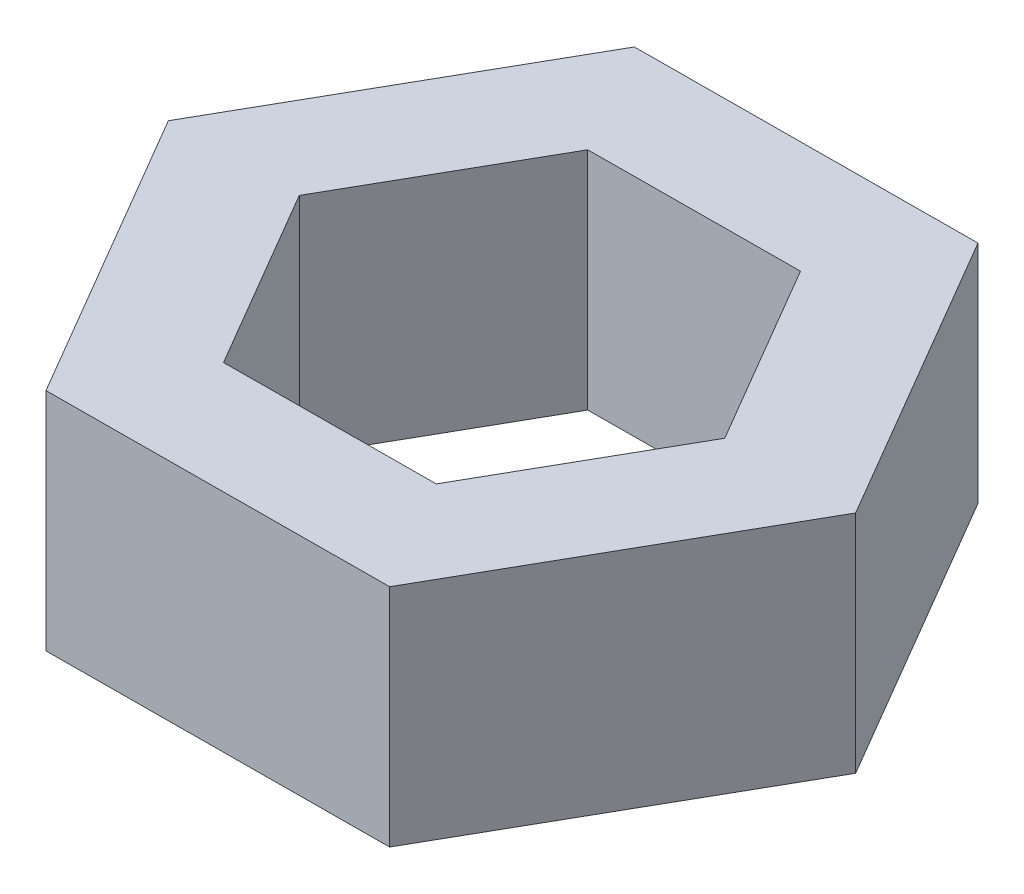
ISO-10303-21;
HEADER;
FILE_DESCRIPTION(('STEP AP214'),'2;1');
FILE_NAME('part.step','',(''),(''),'','','');
FILE_SCHEMA(('AUTOMOTIVE_DESIGN { 1 0 10303 214 1 1 1 1 }'));
ENDSEC;
DATA;
#1=APPLICATION_CONTEXT('core data for automotive mechanical design processes');
#2=APPLICATION_PROTOCOL_DEFINITION('international standard','automotive_design',2000,#1);
#3=PRODUCT_CONTEXT('',#1,'mechanical');
#4=PRODUCT('Part','Part','',(#3));
#5=PRODUCT_RELATED_PRODUCT_CATEGORY('part','',(#4));
#6=PRODUCT_DEFINITION_FORMATION('','',#4);
#7=PRODUCT_DEFINITION_CONTEXT('part definition',#1,'design');
#8=PRODUCT_DEFINITION('design','',#6,#7);
#9=PRODUCT_DEFINITION_SHAPE('','',#8);
#10=(LENGTH_UNIT() NAMED_UNIT(*) SI_UNIT(.MILLI.,.METRE.));
#11=(NAMED_UNIT(*) PLANE_ANGLE_UNIT() SI_UNIT($,.RADIAN.));
#12=(NAMED_UNIT(*) SI_UNIT($,.STERADIAN.) SOLID_ANGLE_UNIT());
#13=UNCERTAINTY_MEASURE_WITH_UNIT(LENGTH_MEASURE(1.E-05),#10,'distance_accuracy_value','');
#14=(GEOMETRIC_REPRESENTATION_CONTEXT(3) GLOBAL_UNCERTAINTY_ASSIGNED_CONTEXT((#13)) GLOBAL_UNIT_ASSIGNED_CONTEXT((#10,
#11,#12)) REPRESENTATION_CONTEXT('',''));
#15=CARTESIAN_POINT('',(0.,0.,0.));
#16=DIRECTION('',(0.,0.,1.));
#17=DIRECTION('',(1.,0.,0.));
#18=AXIS2_PLACEMENT_3D('',#15,#16,#17);
#19=CARTESIAN_POINT('',(0.,8.,0.));
#20=DIRECTION('',(0.,1.,0.));
#21=DIRECTION('',(0.,0.,1.));
#22=AXIS2_PLACEMENT_3D('',#19,#20,#21);
#23=PLANE('',#22);
#24=DIRECTION('',(0.494970800435133,0.,-0.868909607909018));
#25=VECTOR('',#24,1.);
#26=CARTESIAN_POINT('',(6.12294987188629,8.,10.46467796286));
#27=LINE('',#26,#25);
#28=CARTESIAN_POINT('',(6.12294987188629,8.,10.46467796286));
#29=VERTEX_POINT('',#28);
#30=CARTESIAN_POINT('',(12.1241518942031,8.,-0.0702911537222046));
#31=VERTEX_POINT('',#30);
#32=EDGE_CURVE('E204',#29,#31,#27,.T.);
#33=ORIENTED_EDGE('',*,*,#32,.T.);
#34=DIRECTION('',(-0.505012393824019,0.,-0.863112091262852));
#35=VECTOR('',#34,1.);
#36=CARTESIAN_POINT('',(12.1241518942031,8.,-0.0702911537222046));
#37=LINE('',#36,#35);
#38=CARTESIAN_POINT('',(6.00120202231681,8.,-10.5349691165822));
#39=VERTEX_POINT('',#38);
#40=EDGE_CURVE('E208',#31,#39,#37,.T.);
#41=ORIENTED_EDGE('',*,*,#40,.T.);
#42=DIRECTION('',(-0.999983194259152,0.,0.00579751664616607));
#43=VECTOR('',#42,1.);
#44=CARTESIAN_POINT('',(6.00120202231681,8.,-10.5349691165822));
#45=LINE('',#44,#43);
#46=CARTESIAN_POINT('',(-6.12294987188629,8.,-10.46467796286));
#47=VERTEX_POINT('',#46);
#48=EDGE_CURVE('E212',#39,#47,#45,.T.);
#49=ORIENTED_EDGE('',*,*,#48,.T.);
#50=DIRECTION('',(-0.494970800435133,0.,0.868909607909018));
#51=VECTOR('',#50,1.);
#52=CARTESIAN_POINT('',(-6.12294987188629,8.,-10.46467796286));
#53=LINE('',#52,#51);
#54=CARTESIAN_POINT('',(-12.1241518942031,8.,0.0702911537221996));
#55=VERTEX_POINT('',#54);
#56=EDGE_CURVE('E215',#47,#55,#53,.T.);
#57=ORIENTED_EDGE('',*,*,#56,.T.);
#58=DIRECTION('',(0.505012393824019,0.,0.863112091262852));
#59=VECTOR('',#58,1.);
#60=CARTESIAN_POINT('',(-12.1241518942031,8.,0.0702911537221996));
#61=LINE('',#60,#59);
#62=CARTESIAN_POINT('',(-6.00120202231681,8.,10.5349691165822));
#63=VERTEX_POINT('',#62);
#64=EDGE_CURVE('E218',#55,#63,#61,.T.);
#65=ORIENTED_EDGE('',*,*,#64,.T.);
#66=DIRECTION('',(0.999983194259152,0.,-0.00579751664616622));
#67=VECTOR('',#66,1.);
#68=CARTESIAN_POINT('',(-6.00120202231681,8.,10.5349691165822));
#69=LINE('',#68,#67);
#70=EDGE_CURVE('E221',#63,#29,#69,.T.);
#71=ORIENTED_EDGE('',*,*,#70,.T.);
#72=EDGE_LOOP('',(#33,#41,#49,#57,#65,#71));
#73=FACE_BOUND('',#72,.T.);
#74=DIRECTION('',(0.494970800435134,0.,-0.868909607909018));
#75=VECTOR('',#74,1.);
#76=CARTESIAN_POINT('',(3.79039753973913,8.,6.47813397700857));
#77=LINE('',#76,#75);
#78=CARTESIAN_POINT('',(3.79039753973913,8.,6.47813397700857));
#79=VERTEX_POINT('',#78);
#80=CARTESIAN_POINT('',(7.5054273630781,8.,-0.0435135713518393));
#81=VERTEX_POINT('',#80);
#82=EDGE_CURVE('E144',#79,#81,#77,.T.);
#83=ORIENTED_EDGE('',*,*,#82,.F.);
#84=DIRECTION('',(0.999983194259152,0.,-0.00579751664616587));
#85=VECTOR('',#84,1.);
#86=CARTESIAN_POINT('',(-3.71502982333897,8.,6.52164754836041));
#87=LINE('',#86,#85);
#88=CARTESIAN_POINT('',(-3.71502982333897,8.,6.52164754836041));
#89=VERTEX_POINT('',#88);
#90=EDGE_CURVE('E135',#89,#79,#87,.T.);
#91=ORIENTED_EDGE('',*,*,#90,.F.);
#92=DIRECTION('',(0.505012393824019,0.,0.863112091262852));
#93=VECTOR('',#92,1.);
#94=CARTESIAN_POINT('',(-7.5054273630781,8.,0.0435135713518386));
#95=LINE('',#94,#93);
#96=CARTESIAN_POINT('',(-7.5054273630781,8.,0.0435135713518389));
#97=VERTEX_POINT('',#96);
#98=EDGE_CURVE('E170',#97,#89,#95,.T.);
#99=ORIENTED_EDGE('',*,*,#98,.F.);
#100=DIRECTION('',(-0.494970800435134,0.,0.868909607909018));
#101=VECTOR('',#100,1.);
#102=CARTESIAN_POINT('',(-3.79039753973913,8.,-6.47813397700857));
#103=LINE('',#102,#101);
#104=CARTESIAN_POINT('',(-3.79039753973913,8.,-6.47813397700857));
#105=VERTEX_POINT('',#104);
#106=EDGE_CURVE('E167',#105,#97,#103,.T.);
#107=ORIENTED_EDGE('',*,*,#106,.F.);
#108=DIRECTION('',(-0.999983194259152,0.,0.0057975166461661));
#109=VECTOR('',#108,1.);
#110=CARTESIAN_POINT('',(3.71502982333897,8.,-6.52164754836041));
#111=LINE('',#110,#109);
#112=CARTESIAN_POINT('',(3.71502982333897,8.,-6.52164754836041));
#113=VERTEX_POINT('',#112);
#114=EDGE_CURVE('E162',#113,#105,#111,.T.);
#115=ORIENTED_EDGE('',*,*,#114,.F.);
#116=DIRECTION('',(-0.505012393824019,0.,-0.863112091262852));
#117=VECTOR('',#116,1.);
#118=CARTESIAN_POINT('',(7.5054273630781,8.,-0.0435135713518393));
#119=LINE('',#118,#117);
#120=EDGE_CURVE('E158',#81,#113,#119,.T.);
#121=ORIENTED_EDGE('',*,*,#120,.F.);
#122=EDGE_LOOP('',(#83,#91,#99,#107,#115,#121));
#123=FACE_BOUND('',#122,.T.);
#124=ADVANCED_FACE('F45',(#73,#123),#23,.T.);
#125=CARTESIAN_POINT('',(0.,0.,0.));
#126=DIRECTION('',(0.,1.,0.));
#127=DIRECTION('',(0.,0.,1.));
#128=AXIS2_PLACEMENT_3D('',#125,#126,#127);
#129=PLANE('',#128);
#130=DIRECTION('',(0.494970800435133,0.,-0.868909607909018));
#131=VECTOR('',#130,1.);
#132=CARTESIAN_POINT('',(6.12294987188629,0.,10.46467796286));
#133=LINE('',#132,#131);
#134=CARTESIAN_POINT('',(6.12294987188629,0.,10.46467796286));
#135=VERTEX_POINT('',#134);
#136=CARTESIAN_POINT('',(12.1241518942031,0.,-0.0702911537222046));
#137=VERTEX_POINT('',#136);
#138=EDGE_CURVE('E153',#135,#137,#133,.T.);
#139=ORIENTED_EDGE('',*,*,#138,.F.);
#140=DIRECTION('',(0.999983194259152,0.,-0.00579751664616622));
#141=VECTOR('',#140,1.);
#142=CARTESIAN_POINT('',(-6.00120202231681,0.,10.5349691165822));
#143=LINE('',#142,#141);
#144=CARTESIAN_POINT('',(-6.00120202231681,0.,10.5349691165822));
#145=VERTEX_POINT('',#144);
#146=EDGE_CURVE('E209',#145,#135,#143,.T.);
#147=ORIENTED_EDGE('',*,*,#146,.F.);
#148=DIRECTION('',(0.505012393824019,0.,0.863112091262852));
#149=VECTOR('',#148,1.);
#150=CARTESIAN_POINT('',(-12.1241518942031,0.,0.0702911537221996));
#151=LINE('',#150,#149);
#152=CARTESIAN_POINT('',(-12.1241518942031,0.,0.0702911537221996));
#153=VERTEX_POINT('',#152);
#154=EDGE_CURVE('E237',#153,#145,#151,.T.);
#155=ORIENTED_EDGE('',*,*,#154,.F.);
#156=DIRECTION('',(-0.494970800435133,0.,0.868909607909018));
#157=VECTOR('',#156,1.);
#158=CARTESIAN_POINT('',(-6.12294987188629,0.,-10.46467796286));
#159=LINE('',#158,#157);
#160=CARTESIAN_POINT('',(-6.12294987188629,0.,-10.46467796286));
#161=VERTEX_POINT('',#160);
#162=EDGE_CURVE('E234',#161,#153,#159,.T.);
#163=ORIENTED_EDGE('',*,*,#162,.F.);
#164=DIRECTION('',(-0.999983194259152,0.,0.00579751664616607));
#165=VECTOR('',#164,1.);
#166=CARTESIAN_POINT('',(6.00120202231681,0.,-10.5349691165822));
#167=LINE('',#166,#165);
#168=CARTESIAN_POINT('',(6.00120202231681,0.,-10.5349691165822));
#169=VERTEX_POINT('',#168);
#170=EDGE_CURVE('E231',#169,#161,#167,.T.);
#171=ORIENTED_EDGE('',*,*,#170,.F.);
#172=DIRECTION('',(-0.505012393824019,0.,-0.863112091262852));
#173=VECTOR('',#172,1.);
#174=CARTESIAN_POINT('',(12.1241518942031,0.,-0.0702911537222046));
#175=LINE('',#174,#173);
#176=EDGE_CURVE('E228',#137,#169,#175,.T.);
#177=ORIENTED_EDGE('',*,*,#176,.F.);
#178=EDGE_LOOP('',(#139,#147,#155,#163,#171,#177));
#179=FACE_BOUND('',#178,.T.);
#180=DIRECTION('',(0.999983194259152,0.,-0.00579751664616587));
#181=VECTOR('',#180,1.);
#182=CARTESIAN_POINT('',(-3.71502982333897,0.,6.52164754836041));
#183=LINE('',#182,#181);
#184=CARTESIAN_POINT('',(-3.71502982333897,0.,6.52164754836041));
#185=VERTEX_POINT('',#184);
#186=CARTESIAN_POINT('',(3.79039753973913,0.,6.47813397700857));
#187=VERTEX_POINT('',#186);
#188=EDGE_CURVE('E69',#185,#187,#183,.T.);
#189=ORIENTED_EDGE('',*,*,#188,.T.);
#190=DIRECTION('',(0.494970800435134,0.,-0.868909607909018));
#191=VECTOR('',#190,1.);
#192=CARTESIAN_POINT('',(3.79039753973913,0.,6.47813397700857));
#193=LINE('',#192,#191);
#194=CARTESIAN_POINT('',(7.5054273630781,0.,-0.0435135713518393));
#195=VERTEX_POINT('',#194);
#196=EDGE_CURVE('E151',#187,#195,#193,.T.);
#197=ORIENTED_EDGE('',*,*,#196,.T.);
#198=DIRECTION('',(-0.505012393824019,0.,-0.863112091262852));
#199=VECTOR('',#198,1.);
#200=CARTESIAN_POINT('',(7.5054273630781,0.,-0.0435135713518393));
#201=LINE('',#200,#199);
#202=CARTESIAN_POINT('',(3.71502982333897,0.,-6.52164754836041));
#203=VERTEX_POINT('',#202);
#204=EDGE_CURVE('E177',#195,#203,#201,.T.);
#205=ORIENTED_EDGE('',*,*,#204,.T.);
#206=DIRECTION('',(-0.999983194259152,0.,0.0057975166461661));
#207=VECTOR('',#206,1.);
#208=CARTESIAN_POINT('',(3.71502982333897,0.,-6.52164754836041));
#209=LINE('',#208,#207);
#210=CARTESIAN_POINT('',(-3.79039753973913,0.,-6.47813397700857));
#211=VERTEX_POINT('',#210);
#212=EDGE_CURVE('E181',#203,#211,#209,.T.);
#213=ORIENTED_EDGE('',*,*,#212,.T.);
#214=DIRECTION('',(-0.494970800435134,0.,0.868909607909018));
#215=VECTOR('',#214,1.);
#216=CARTESIAN_POINT('',(-3.79039753973913,0.,-6.47813397700857));
#217=LINE('',#216,#215);
#218=CARTESIAN_POINT('',(-7.5054273630781,0.,0.0435135713518386));
#219=VERTEX_POINT('',#218);
#220=EDGE_CURVE('E185',#211,#219,#217,.T.);
#221=ORIENTED_EDGE('',*,*,#220,.T.);
#222=DIRECTION('',(0.505012393824019,0.,0.863112091262852));
#223=VECTOR('',#222,1.);
#224=CARTESIAN_POINT('',(-7.5054273630781,0.,0.0435135713518386));
#225=LINE('',#224,#223);
#226=EDGE_CURVE('E145',#219,#185,#225,.T.);
#227=ORIENTED_EDGE('',*,*,#226,.T.);
#228=EDGE_LOOP('',(#189,#197,#205,#213,#221,#227));
#229=FACE_BOUND('',#228,.T.);
#230=ADVANCED_FACE('F268',(#179,#229),#129,.F.);
#231=CARTESIAN_POINT('',(6.12294987188629,8.,10.46467796286));
#232=DIRECTION('',(-0.868909607909018,0.,-0.494970800435133));
#233=DIRECTION('',(-0.494970800435133,0.,0.868909607909018));
#234=AXIS2_PLACEMENT_3D('',#231,#232,#233);
#235=PLANE('',#234);
#236=ORIENTED_EDGE('',*,*,#138,.T.);
#237=DIRECTION('',(0.,-1.,0.));
#238=VECTOR('',#237,1.);
#239=CARTESIAN_POINT('',(12.1241518942031,8.,-0.0702911537222046));
#240=LINE('',#239,#238);
#241=EDGE_CURVE('E11',#31,#137,#240,.T.);
#242=ORIENTED_EDGE('',*,*,#241,.F.);
#243=ORIENTED_EDGE('',*,*,#32,.F.);
#244=DIRECTION('',(0.,-1.,0.));
#245=VECTOR('',#244,1.);
#246=CARTESIAN_POINT('',(6.12294987188629,8.,10.46467796286));
#247=LINE('',#246,#245);
#248=EDGE_CURVE('E224',#29,#135,#247,.T.);
#249=ORIENTED_EDGE('',*,*,#248,.T.);
#250=EDGE_LOOP('',(#236,#242,#243,#249));
#251=FACE_BOUND('',#250,.T.);
#252=ADVANCED_FACE('F47',(#251),#235,.F.);
#253=CARTESIAN_POINT('',(12.1241518942031,8.,-0.0702911537222046));
#254=DIRECTION('',(-0.863112091262852,0.,0.505012393824019));
#255=DIRECTION('',(0.505012393824019,0.,0.863112091262852));
#256=AXIS2_PLACEMENT_3D('',#253,#254,#255);
#257=PLANE('',#256);
#258=ORIENTED_EDGE('',*,*,#176,.T.);
#259=DIRECTION('',(0.,-1.,0.));
#260=VECTOR('',#259,1.);
#261=CARTESIAN_POINT('',(6.00120202231681,8.,-10.5349691165822));
#262=LINE('',#261,#260);
#263=EDGE_CURVE('E54',#39,#169,#262,.T.);
#264=ORIENTED_EDGE('',*,*,#263,.F.);
#265=ORIENTED_EDGE('',*,*,#40,.F.);
#266=ORIENTED_EDGE('',*,*,#241,.T.);
#267=EDGE_LOOP('',(#258,#264,#265,#266));
#268=FACE_BOUND('',#267,.T.);
#269=ADVANCED_FACE('F285',(#268),#257,.F.);
#270=CARTESIAN_POINT('',(6.00120202231681,8.,-10.5349691165822));
#271=DIRECTION('',(0.00579751664616607,0.,0.999983194259152));
#272=DIRECTION('',(0.999983194259152,0.,-0.00579751664616607));
#273=AXIS2_PLACEMENT_3D('',#270,#271,#272);
#274=PLANE('',#273);
#275=ORIENTED_EDGE('',*,*,#170,.T.);
#276=DIRECTION('',(0.,-1.,0.));
#277=VECTOR('',#276,1.);
#278=CARTESIAN_POINT('',(-6.12294987188629,8.,-10.46467796286));
#279=LINE('',#278,#277);
#280=EDGE_CURVE('E253',#47,#161,#279,.T.);
#281=ORIENTED_EDGE('',*,*,#280,.F.);
#282=ORIENTED_EDGE('',*,*,#48,.F.);
#283=ORIENTED_EDGE('',*,*,#263,.T.);
#284=EDGE_LOOP('',(#275,#281,#282,#283));
#285=FACE_BOUND('',#284,.T.);
#286=ADVANCED_FACE('F262',(#285),#274,.F.);
#287=CARTESIAN_POINT('',(-6.12294987188629,8.,-10.46467796286));
#288=DIRECTION('',(0.868909607909018,0.,0.494970800435133));
#289=DIRECTION('',(0.494970800435133,0.,-0.868909607909018));
#290=AXIS2_PLACEMENT_3D('',#287,#288,#289);
#291=PLANE('',#290);
#292=ORIENTED_EDGE('',*,*,#162,.T.);
#293=DIRECTION('',(0.,-1.,0.));
#294=VECTOR('',#293,1.);
#295=CARTESIAN_POINT('',(-12.1241518942031,8.,0.0702911537221996));
#296=LINE('',#295,#294);
#297=EDGE_CURVE('E249',#55,#153,#296,.T.);
#298=ORIENTED_EDGE('',*,*,#297,.F.);
#299=ORIENTED_EDGE('',*,*,#56,.F.);
#300=ORIENTED_EDGE('',*,*,#280,.T.);
#301=EDGE_LOOP('',(#292,#298,#299,#300));
#302=FACE_BOUND('',#301,.T.);
#303=ADVANCED_FACE('F274',(#302),#291,.F.);
#304=CARTESIAN_POINT('',(-12.1241518942031,8.,0.0702911537221996));
#305=DIRECTION('',(0.863112091262852,0.,-0.505012393824019));
#306=DIRECTION('',(-0.505012393824019,0.,-0.863112091262852));
#307=AXIS2_PLACEMENT_3D('',#304,#305,#306);
#308=PLANE('',#307);
#309=ORIENTED_EDGE('',*,*,#154,.T.);
#310=DIRECTION('',(0.,-1.,0.));
#311=VECTOR('',#310,1.);
#312=CARTESIAN_POINT('',(-6.00120202231681,8.,10.5349691165822));
#313=LINE('',#312,#311);
#314=EDGE_CURVE('E245',#63,#145,#313,.T.);
#315=ORIENTED_EDGE('',*,*,#314,.F.);
#316=ORIENTED_EDGE('',*,*,#64,.F.);
#317=ORIENTED_EDGE('',*,*,#297,.T.);
#318=EDGE_LOOP('',(#309,#315,#316,#317));
#319=FACE_BOUND('',#318,.T.);
#320=ADVANCED_FACE('F278',(#319),#308,.F.);
#321=CARTESIAN_POINT('',(-6.00120202231681,8.,10.5349691165822));
#322=DIRECTION('',(-0.00579751664616622,0.,-0.999983194259152));
#323=DIRECTION('',(-0.999983194259152,0.,0.00579751664616622));
#324=AXIS2_PLACEMENT_3D('',#321,#322,#323);
#325=PLANE('',#324);
#326=ORIENTED_EDGE('',*,*,#146,.T.);
#327=ORIENTED_EDGE('',*,*,#248,.F.);
#328=ORIENTED_EDGE('',*,*,#70,.F.);
#329=ORIENTED_EDGE('',*,*,#314,.T.);
#330=EDGE_LOOP('',(#326,#327,#328,#329));
#331=FACE_BOUND('',#330,.T.);
#332=ADVANCED_FACE('F288',(#331),#325,.F.);
#333=CARTESIAN_POINT('',(-3.71502982333897,8.,6.52164754836041));
#334=DIRECTION('',(-0.00579751664616587,0.,-0.999983194259152));
#335=DIRECTION('',(-0.999983194259152,0.,0.00579751664616587));
#336=AXIS2_PLACEMENT_3D('',#333,#334,#335);
#337=PLANE('',#336);
#338=ORIENTED_EDGE('',*,*,#188,.F.);
#339=DIRECTION('',(0.,-1.,0.));
#340=VECTOR('',#339,1.);
#341=CARTESIAN_POINT('',(-3.71502982333897,8.,6.52164754836041));
#342=LINE('',#341,#340);
#343=EDGE_CURVE('E139',#89,#185,#342,.T.);
#344=ORIENTED_EDGE('',*,*,#343,.F.);
#345=ORIENTED_EDGE('',*,*,#90,.T.);
#346=DIRECTION('',(0.,-1.,0.));
#347=VECTOR('',#346,1.);
#348=CARTESIAN_POINT('',(3.79039753973913,8.,6.47813397700857));
#349=LINE('',#348,#347);
#350=EDGE_CURVE('E138',#79,#187,#349,.T.);
#351=ORIENTED_EDGE('',*,*,#350,.T.);
#352=EDGE_LOOP('',(#338,#344,#345,#351));
#353=FACE_BOUND('',#352,.T.);
#354=ADVANCED_FACE('F137',(#353),#337,.T.);
#355=CARTESIAN_POINT('',(3.79039753973913,8.,6.47813397700857));
#356=DIRECTION('',(-0.868909607909018,0.,-0.494970800435133));
#357=DIRECTION('',(-0.494970800435133,0.,0.868909607909018));
#358=AXIS2_PLACEMENT_3D('',#355,#356,#357);
#359=PLANE('',#358);
#360=ORIENTED_EDGE('',*,*,#196,.F.);
#361=ORIENTED_EDGE('',*,*,#350,.F.);
#362=ORIENTED_EDGE('',*,*,#82,.T.);
#363=DIRECTION('',(0.,-1.,0.));
#364=VECTOR('',#363,1.);
#365=CARTESIAN_POINT('',(7.5054273630781,8.,-0.0435135713518393));
#366=LINE('',#365,#364);
#367=EDGE_CURVE('E154',#81,#195,#366,.T.);
#368=ORIENTED_EDGE('',*,*,#367,.T.);
#369=EDGE_LOOP('',(#360,#361,#362,#368));
#370=FACE_BOUND('',#369,.T.);
#371=ADVANCED_FACE('F148',(#370),#359,.T.);
#372=CARTESIAN_POINT('',(7.5054273630781,8.,-0.0435135713518393));
#373=DIRECTION('',(-0.863112091262852,0.,0.505012393824019));
#374=DIRECTION('',(0.505012393824019,0.,0.863112091262852));
#375=AXIS2_PLACEMENT_3D('',#372,#373,#374);
#376=PLANE('',#375);
#377=ORIENTED_EDGE('',*,*,#204,.F.);
#378=ORIENTED_EDGE('',*,*,#367,.F.);
#379=ORIENTED_EDGE('',*,*,#120,.T.);
#380=DIRECTION('',(0.,-1.,0.));
#381=VECTOR('',#380,1.);
#382=CARTESIAN_POINT('',(3.71502982333897,8.,-6.52164754836041));
#383=LINE('',#382,#381);
#384=EDGE_CURVE('E199',#113,#203,#383,.T.);
#385=ORIENTED_EDGE('',*,*,#384,.T.);
#386=EDGE_LOOP('',(#377,#378,#379,#385));
#387=FACE_BOUND('',#386,.T.);
#388=ADVANCED_FACE('F306',(#387),#376,.T.);
#389=CARTESIAN_POINT('',(3.71502982333897,8.,-6.52164754836041));
#390=DIRECTION('',(0.0057975166461661,0.,0.999983194259152));
#391=DIRECTION('',(0.999983194259152,0.,-0.0057975166461661));
#392=AXIS2_PLACEMENT_3D('',#389,#390,#391);
#393=PLANE('',#392);
#394=ORIENTED_EDGE('',*,*,#212,.F.);
#395=ORIENTED_EDGE('',*,*,#384,.F.);
#396=ORIENTED_EDGE('',*,*,#114,.T.);
#397=DIRECTION('',(0.,-1.,0.));
#398=VECTOR('',#397,1.);
#399=CARTESIAN_POINT('',(-3.79039753973913,8.,-6.47813397700857));
#400=LINE('',#399,#398);
#401=EDGE_CURVE('E196',#105,#211,#400,.T.);
#402=ORIENTED_EDGE('',*,*,#401,.T.);
#403=EDGE_LOOP('',(#394,#395,#396,#402));
#404=FACE_BOUND('',#403,.T.);
#405=ADVANCED_FACE('F309',(#404),#393,.T.);
#406=CARTESIAN_POINT('',(-3.79039753973913,8.,-6.47813397700857));
#407=DIRECTION('',(0.868909607909018,0.,0.494970800435134));
#408=DIRECTION('',(0.494970800435134,0.,-0.868909607909018));
#409=AXIS2_PLACEMENT_3D('',#406,#407,#408);
#410=PLANE('',#409);
#411=ORIENTED_EDGE('',*,*,#220,.F.);
#412=ORIENTED_EDGE('',*,*,#401,.F.);
#413=ORIENTED_EDGE('',*,*,#106,.T.);
#414=DIRECTION('',(0.,-1.,0.));
#415=VECTOR('',#414,1.);
#416=CARTESIAN_POINT('',(-7.5054273630781,8.,0.0435135713518386));
#417=LINE('',#416,#415);
#418=EDGE_CURVE('E61',#97,#219,#417,.T.);
#419=ORIENTED_EDGE('',*,*,#418,.T.);
#420=EDGE_LOOP('',(#411,#412,#413,#419));
#421=FACE_BOUND('',#420,.T.);
#422=ADVANCED_FACE('F313',(#421),#410,.T.);
#423=CARTESIAN_POINT('',(-7.5054273630781,8.,0.0435135713518386));
#424=DIRECTION('',(0.863112091262852,0.,-0.505012393824019));
#425=DIRECTION('',(-0.505012393824019,0.,-0.863112091262852));
#426=AXIS2_PLACEMENT_3D('',#423,#424,#425);
#427=PLANE('',#426);
#428=ORIENTED_EDGE('',*,*,#226,.F.);
#429=ORIENTED_EDGE('',*,*,#418,.F.);
#430=ORIENTED_EDGE('',*,*,#98,.T.);
#431=ORIENTED_EDGE('',*,*,#343,.T.);
#432=EDGE_LOOP('',(#428,#429,#430,#431));
#433=FACE_BOUND('',#432,.T.);
#434=ADVANCED_FACE('F317',(#433),#427,.T.);
#435=CLOSED_SHELL('',(#124,#230,#252,#269,#286,#303,#320,#332,#354,#371,#388,#405,#422,#434));
#436=MANIFOLD_SOLID_BREP('B2',#435);
#437=ADVANCED_BREP_SHAPE_REPRESENTATION('',(#18,#436),#14);
#438=SHAPE_DEFINITION_REPRESENTATION(#9,#437);
ENDSEC;
END-ISO-10303-21;
